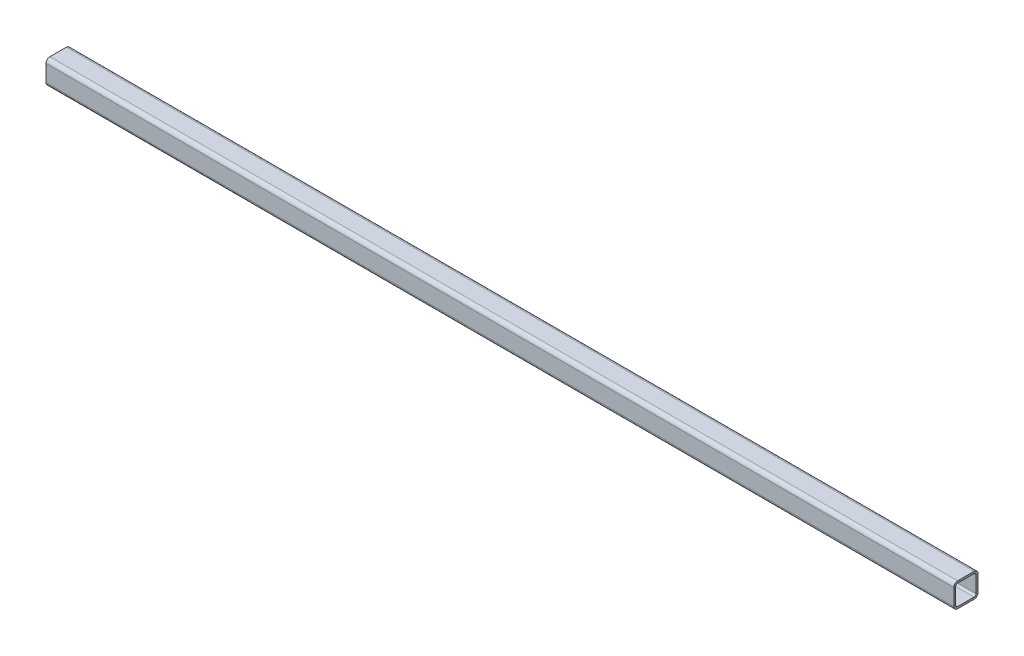
ISO-10303-21;
HEADER;
FILE_DESCRIPTION(('STEP AP214'),'2;1');
FILE_NAME('part.step','',(''),(''),'','','');
FILE_SCHEMA(('AUTOMOTIVE_DESIGN { 1 0 10303 214 1 1 1 1 }'));
ENDSEC;
DATA;
#1=APPLICATION_CONTEXT('core data for automotive mechanical design processes');
#2=APPLICATION_PROTOCOL_DEFINITION('international standard','automotive_design',2000,#1);
#3=PRODUCT_CONTEXT('',#1,'mechanical');
#4=PRODUCT('Part','Part','',(#3));
#5=PRODUCT_RELATED_PRODUCT_CATEGORY('part','',(#4));
#6=PRODUCT_DEFINITION_FORMATION('','',#4);
#7=PRODUCT_DEFINITION_CONTEXT('part definition',#1,'design');
#8=PRODUCT_DEFINITION('design','',#6,#7);
#9=PRODUCT_DEFINITION_SHAPE('','',#8);
#10=(LENGTH_UNIT() NAMED_UNIT(*) SI_UNIT(.MILLI.,.METRE.));
#11=(NAMED_UNIT(*) PLANE_ANGLE_UNIT() SI_UNIT($,.RADIAN.));
#12=(NAMED_UNIT(*) SI_UNIT($,.STERADIAN.) SOLID_ANGLE_UNIT());
#13=UNCERTAINTY_MEASURE_WITH_UNIT(LENGTH_MEASURE(1.E-05),#10,'distance_accuracy_value','');
#14=(GEOMETRIC_REPRESENTATION_CONTEXT(3) GLOBAL_UNCERTAINTY_ASSIGNED_CONTEXT((#13)) GLOBAL_UNIT_ASSIGNED_CONTEXT((#10,
#11,#12)) REPRESENTATION_CONTEXT('',''));
#15=CARTESIAN_POINT('',(0.,0.,0.));
#16=DIRECTION('',(0.,0.,1.));
#17=DIRECTION('',(1.,0.,0.));
#18=AXIS2_PLACEMENT_3D('',#15,#16,#17);
#19=CARTESIAN_POINT('',(1500.,13.6,-13.6));
#20=DIRECTION('',(-1.,0.,0.));
#21=DIRECTION('',(0.,0.,1.));
#22=AXIS2_PLACEMENT_3D('',#19,#20,#21);
#23=CYLINDRICAL_SURFACE('',#22,6.4);
#24=CARTESIAN_POINT('',(0.,13.6,-13.6));
#25=DIRECTION('',(1.,0.,0.));
#26=DIRECTION('',(0.,0.,-1.));
#27=AXIS2_PLACEMENT_3D('',#24,#25,#26);
#28=CIRCLE('',#27,6.4);
#29=CARTESIAN_POINT('',(0.,13.6,-20.));
#30=VERTEX_POINT('',#29);
#31=CARTESIAN_POINT('',(0.,20.,-13.6));
#32=VERTEX_POINT('',#31);
#33=EDGE_CURVE('E234',#30,#32,#28,.T.);
#34=ORIENTED_EDGE('',*,*,#33,.T.);
#35=DIRECTION('',(-1.,0.,0.));
#36=VECTOR('',#35,1.);
#37=CARTESIAN_POINT('',(1500.,20.,-13.6));
#38=LINE('',#37,#36);
#39=CARTESIAN_POINT('',(1500.,20.,-13.6));
#40=VERTEX_POINT('',#39);
#41=EDGE_CURVE('E12',#40,#32,#38,.T.);
#42=ORIENTED_EDGE('',*,*,#41,.F.);
#43=CARTESIAN_POINT('',(1500.,13.6,-13.6));
#44=DIRECTION('',(1.,0.,0.));
#45=DIRECTION('',(0.,0.,-1.));
#46=AXIS2_PLACEMENT_3D('',#43,#44,#45);
#47=CIRCLE('',#46,6.4);
#48=CARTESIAN_POINT('',(1500.,13.6,-20.));
#49=VERTEX_POINT('',#48);
#50=EDGE_CURVE('E312',#49,#40,#47,.T.);
#51=ORIENTED_EDGE('',*,*,#50,.F.);
#52=DIRECTION('',(-1.,0.,0.));
#53=VECTOR('',#52,1.);
#54=CARTESIAN_POINT('',(1500.,13.6,-20.));
#55=LINE('',#54,#53);
#56=EDGE_CURVE('E249',#49,#30,#55,.T.);
#57=ORIENTED_EDGE('',*,*,#56,.T.);
#58=EDGE_LOOP('',(#34,#42,#51,#57));
#59=FACE_BOUND('',#58,.T.);
#60=ADVANCED_FACE('F62',(#59),#23,.T.);
#61=CARTESIAN_POINT('',(1500.,20.,-13.6));
#62=DIRECTION('',(0.,-1.,0.));
#63=DIRECTION('',(0.,0.,-1.));
#64=AXIS2_PLACEMENT_3D('',#61,#62,#63);
#65=PLANE('',#64);
#66=DIRECTION('',(0.,0.,1.));
#67=VECTOR('',#66,1.);
#68=CARTESIAN_POINT('',(0.,20.,-13.6));
#69=LINE('',#68,#67);
#70=CARTESIAN_POINT('',(0.,20.,13.6));
#71=VERTEX_POINT('',#70);
#72=EDGE_CURVE('E237',#32,#71,#69,.T.);
#73=ORIENTED_EDGE('',*,*,#72,.T.);
#74=DIRECTION('',(-1.,0.,0.));
#75=VECTOR('',#74,1.);
#76=CARTESIAN_POINT('',(1500.,20.,13.6));
#77=LINE('',#76,#75);
#78=CARTESIAN_POINT('',(1500.,20.,13.6));
#79=VERTEX_POINT('',#78);
#80=EDGE_CURVE('E72',#79,#71,#77,.T.);
#81=ORIENTED_EDGE('',*,*,#80,.F.);
#82=DIRECTION('',(0.,0.,1.));
#83=VECTOR('',#82,1.);
#84=CARTESIAN_POINT('',(1500.,20.,-13.6));
#85=LINE('',#84,#83);
#86=EDGE_CURVE('E314',#40,#79,#85,.T.);
#87=ORIENTED_EDGE('',*,*,#86,.F.);
#88=ORIENTED_EDGE('',*,*,#41,.T.);
#89=EDGE_LOOP('',(#73,#81,#87,#88));
#90=FACE_BOUND('',#89,.T.);
#91=ADVANCED_FACE('F349',(#90),#65,.F.);
#92=CARTESIAN_POINT('',(1500.,13.6,13.6));
#93=DIRECTION('',(-1.,0.,0.));
#94=DIRECTION('',(0.,0.,1.));
#95=AXIS2_PLACEMENT_3D('',#92,#93,#94);
#96=CYLINDRICAL_SURFACE('',#95,6.4);
#97=CARTESIAN_POINT('',(0.,13.6,13.6));
#98=DIRECTION('',(1.,0.,0.));
#99=DIRECTION('',(0.,0.,-1.));
#100=AXIS2_PLACEMENT_3D('',#97,#98,#99);
#101=CIRCLE('',#100,6.4);
#102=CARTESIAN_POINT('',(0.,13.6,20.));
#103=VERTEX_POINT('',#102);
#104=EDGE_CURVE('E239',#71,#103,#101,.T.);
#105=ORIENTED_EDGE('',*,*,#104,.T.);
#106=DIRECTION('',(-1.,0.,0.));
#107=VECTOR('',#106,1.);
#108=CARTESIAN_POINT('',(1500.,13.6,20.));
#109=LINE('',#108,#107);
#110=CARTESIAN_POINT('',(1500.,13.6,20.));
#111=VERTEX_POINT('',#110);
#112=EDGE_CURVE('E256',#111,#103,#109,.T.);
#113=ORIENTED_EDGE('',*,*,#112,.F.);
#114=CARTESIAN_POINT('',(1500.,13.6,13.6));
#115=DIRECTION('',(1.,0.,0.));
#116=DIRECTION('',(0.,0.,-1.));
#117=AXIS2_PLACEMENT_3D('',#114,#115,#116);
#118=CIRCLE('',#117,6.4);
#119=EDGE_CURVE('E316',#79,#111,#118,.T.);
#120=ORIENTED_EDGE('',*,*,#119,.F.);
#121=ORIENTED_EDGE('',*,*,#80,.T.);
#122=EDGE_LOOP('',(#105,#113,#120,#121));
#123=FACE_BOUND('',#122,.T.);
#124=ADVANCED_FACE('F354',(#123),#96,.T.);
#125=CARTESIAN_POINT('',(1500.,-13.6,20.));
#126=DIRECTION('',(0.,0.,-1.));
#127=DIRECTION('',(0.,1.,0.));
#128=AXIS2_PLACEMENT_3D('',#125,#126,#127);
#129=PLANE('',#128);
#130=DIRECTION('',(0.,-1.,0.));
#131=VECTOR('',#130,1.);
#132=CARTESIAN_POINT('',(0.,-13.6,20.));
#133=LINE('',#132,#131);
#134=CARTESIAN_POINT('',(0.,-13.6,20.));
#135=VERTEX_POINT('',#134);
#136=EDGE_CURVE('E241',#103,#135,#133,.T.);
#137=ORIENTED_EDGE('',*,*,#136,.T.);
#138=DIRECTION('',(-1.,0.,0.));
#139=VECTOR('',#138,1.);
#140=CARTESIAN_POINT('',(1500.,-13.6,20.));
#141=LINE('',#140,#139);
#142=CARTESIAN_POINT('',(1500.,-13.6,20.));
#143=VERTEX_POINT('',#142);
#144=EDGE_CURVE('E253',#143,#135,#141,.T.);
#145=ORIENTED_EDGE('',*,*,#144,.F.);
#146=DIRECTION('',(0.,-1.,0.));
#147=VECTOR('',#146,1.);
#148=CARTESIAN_POINT('',(1500.,-13.6,20.));
#149=LINE('',#148,#147);
#150=EDGE_CURVE('E318',#111,#143,#149,.T.);
#151=ORIENTED_EDGE('',*,*,#150,.F.);
#152=ORIENTED_EDGE('',*,*,#112,.T.);
#153=EDGE_LOOP('',(#137,#145,#151,#152));
#154=FACE_BOUND('',#153,.T.);
#155=ADVANCED_FACE('F324',(#154),#129,.F.);
#156=CARTESIAN_POINT('',(1500.,-13.6,13.6));
#157=DIRECTION('',(-1.,0.,0.));
#158=DIRECTION('',(0.,0.,1.));
#159=AXIS2_PLACEMENT_3D('',#156,#157,#158);
#160=CYLINDRICAL_SURFACE('',#159,6.4);
#161=CARTESIAN_POINT('',(0.,-13.6,13.6));
#162=DIRECTION('',(1.,0.,0.));
#163=DIRECTION('',(0.,0.,-1.));
#164=AXIS2_PLACEMENT_3D('',#161,#162,#163);
#165=CIRCLE('',#164,6.4);
#166=CARTESIAN_POINT('',(0.,-20.,13.6));
#167=VERTEX_POINT('',#166);
#168=EDGE_CURVE('E243',#135,#167,#165,.T.);
#169=ORIENTED_EDGE('',*,*,#168,.T.);
#170=DIRECTION('',(-1.,0.,0.));
#171=VECTOR('',#170,1.);
#172=CARTESIAN_POINT('',(1500.,-20.,13.6));
#173=LINE('',#172,#171);
#174=CARTESIAN_POINT('',(1500.,-20.,13.6));
#175=VERTEX_POINT('',#174);
#176=EDGE_CURVE('E201',#175,#167,#173,.T.);
#177=ORIENTED_EDGE('',*,*,#176,.F.);
#178=CARTESIAN_POINT('',(1500.,-13.6,13.6));
#179=DIRECTION('',(1.,0.,0.));
#180=DIRECTION('',(0.,0.,-1.));
#181=AXIS2_PLACEMENT_3D('',#178,#179,#180);
#182=CIRCLE('',#181,6.4);
#183=EDGE_CURVE('E192',#143,#175,#182,.T.);
#184=ORIENTED_EDGE('',*,*,#183,.F.);
#185=ORIENTED_EDGE('',*,*,#144,.T.);
#186=EDGE_LOOP('',(#169,#177,#184,#185));
#187=FACE_BOUND('',#186,.T.);
#188=ADVANCED_FACE('F328',(#187),#160,.T.);
#189=CARTESIAN_POINT('',(1500.,-20.,13.6));
#190=DIRECTION('',(0.,1.,0.));
#191=DIRECTION('',(0.,0.,1.));
#192=AXIS2_PLACEMENT_3D('',#189,#190,#191);
#193=PLANE('',#192);
#194=DIRECTION('',(0.,0.,-1.));
#195=VECTOR('',#194,1.);
#196=CARTESIAN_POINT('',(0.,-20.,13.6));
#197=LINE('',#196,#195);
#198=CARTESIAN_POINT('',(0.,-20.,-13.6));
#199=VERTEX_POINT('',#198);
#200=EDGE_CURVE('E200',#167,#199,#197,.T.);
#201=ORIENTED_EDGE('',*,*,#200,.T.);
#202=DIRECTION('',(-1.,0.,0.));
#203=VECTOR('',#202,1.);
#204=CARTESIAN_POINT('',(1500.,-20.,-13.6));
#205=LINE('',#204,#203);
#206=CARTESIAN_POINT('',(1500.,-20.,-13.6));
#207=VERTEX_POINT('',#206);
#208=EDGE_CURVE('E197',#207,#199,#205,.T.);
#209=ORIENTED_EDGE('',*,*,#208,.F.);
#210=DIRECTION('',(0.,0.,-1.));
#211=VECTOR('',#210,1.);
#212=CARTESIAN_POINT('',(1500.,-20.,13.6));
#213=LINE('',#212,#211);
#214=EDGE_CURVE('E186',#175,#207,#213,.T.);
#215=ORIENTED_EDGE('',*,*,#214,.F.);
#216=ORIENTED_EDGE('',*,*,#176,.T.);
#217=EDGE_LOOP('',(#201,#209,#215,#216));
#218=FACE_BOUND('',#217,.T.);
#219=ADVANCED_FACE('F198',(#218),#193,.F.);
#220=CARTESIAN_POINT('',(1500.,-13.6,-13.6));
#221=DIRECTION('',(-1.,0.,0.));
#222=DIRECTION('',(0.,0.,1.));
#223=AXIS2_PLACEMENT_3D('',#220,#221,#222);
#224=CYLINDRICAL_SURFACE('',#223,6.4);
#225=CARTESIAN_POINT('',(0.,-13.6,-13.6));
#226=DIRECTION('',(1.,0.,0.));
#227=DIRECTION('',(0.,0.,-1.));
#228=AXIS2_PLACEMENT_3D('',#225,#226,#227);
#229=CIRCLE('',#228,6.4);
#230=CARTESIAN_POINT('',(0.,-13.6,-20.));
#231=VERTEX_POINT('',#230);
#232=EDGE_CURVE('E134',#199,#231,#229,.T.);
#233=ORIENTED_EDGE('',*,*,#232,.T.);
#234=DIRECTION('',(-1.,0.,0.));
#235=VECTOR('',#234,1.);
#236=CARTESIAN_POINT('',(1500.,-13.6,-20.));
#237=LINE('',#236,#235);
#238=CARTESIAN_POINT('',(1500.,-13.6,-20.));
#239=VERTEX_POINT('',#238);
#240=EDGE_CURVE('E202',#239,#231,#237,.T.);
#241=ORIENTED_EDGE('',*,*,#240,.F.);
#242=CARTESIAN_POINT('',(1500.,-13.6,-13.6));
#243=DIRECTION('',(1.,0.,0.));
#244=DIRECTION('',(0.,0.,-1.));
#245=AXIS2_PLACEMENT_3D('',#242,#243,#244);
#246=CIRCLE('',#245,6.4);
#247=EDGE_CURVE('E190',#207,#239,#246,.T.);
#248=ORIENTED_EDGE('',*,*,#247,.F.);
#249=ORIENTED_EDGE('',*,*,#208,.T.);
#250=EDGE_LOOP('',(#233,#241,#248,#249));
#251=FACE_BOUND('',#250,.T.);
#252=ADVANCED_FACE('F204',(#251),#224,.T.);
#253=CARTESIAN_POINT('',(1500.,13.6,13.6));
#254=DIRECTION('',(-1.,0.,0.));
#255=DIRECTION('',(0.,0.,1.));
#256=AXIS2_PLACEMENT_3D('',#253,#254,#255);
#257=CYLINDRICAL_SURFACE('',#256,3.2);
#258=CARTESIAN_POINT('',(0.,13.6,13.6));
#259=DIRECTION('',(1.,0.,0.));
#260=DIRECTION('',(0.,0.,-1.));
#261=AXIS2_PLACEMENT_3D('',#258,#259,#260);
#262=CIRCLE('',#261,3.2);
#263=CARTESIAN_POINT('',(0.,16.8,13.6));
#264=VERTEX_POINT('',#263);
#265=CARTESIAN_POINT('',(0.,13.6,16.8));
#266=VERTEX_POINT('',#265);
#267=EDGE_CURVE('E210',#264,#266,#262,.T.);
#268=ORIENTED_EDGE('',*,*,#267,.F.);
#269=DIRECTION('',(-1.,0.,0.));
#270=VECTOR('',#269,1.);
#271=CARTESIAN_POINT('',(1500.,16.8,13.6));
#272=LINE('',#271,#270);
#273=CARTESIAN_POINT('',(1500.,16.8,13.6));
#274=VERTEX_POINT('',#273);
#275=EDGE_CURVE('E66',#274,#264,#272,.T.);
#276=ORIENTED_EDGE('',*,*,#275,.F.);
#277=CARTESIAN_POINT('',(1500.,13.6,13.6));
#278=DIRECTION('',(1.,0.,0.));
#279=DIRECTION('',(0.,0.,-1.));
#280=AXIS2_PLACEMENT_3D('',#277,#278,#279);
#281=CIRCLE('',#280,3.2);
#282=CARTESIAN_POINT('',(1500.,13.6,16.8));
#283=VERTEX_POINT('',#282);
#284=EDGE_CURVE('E248',#274,#283,#281,.T.);
#285=ORIENTED_EDGE('',*,*,#284,.T.);
#286=DIRECTION('',(-1.,0.,0.));
#287=VECTOR('',#286,1.);
#288=CARTESIAN_POINT('',(1500.,13.6,16.8));
#289=LINE('',#288,#287);
#290=EDGE_CURVE('E206',#283,#266,#289,.T.);
#291=ORIENTED_EDGE('',*,*,#290,.T.);
#292=EDGE_LOOP('',(#268,#276,#285,#291));
#293=FACE_BOUND('',#292,.T.);
#294=ADVANCED_FACE('F64',(#293),#257,.F.);
#295=CARTESIAN_POINT('',(1500.,16.8,-13.6));
#296=DIRECTION('',(0.,-1.,0.));
#297=DIRECTION('',(0.,0.,-1.));
#298=AXIS2_PLACEMENT_3D('',#295,#296,#297);
#299=PLANE('',#298);
#300=DIRECTION('',(0.,0.,1.));
#301=VECTOR('',#300,1.);
#302=CARTESIAN_POINT('',(0.,16.8,-13.6));
#303=LINE('',#302,#301);
#304=CARTESIAN_POINT('',(0.,16.8,-13.6));
#305=VERTEX_POINT('',#304);
#306=EDGE_CURVE('E213',#305,#264,#303,.T.);
#307=ORIENTED_EDGE('',*,*,#306,.F.);
#308=DIRECTION('',(-1.,0.,0.));
#309=VECTOR('',#308,1.);
#310=CARTESIAN_POINT('',(1500.,16.8,-13.6));
#311=LINE('',#310,#309);
#312=CARTESIAN_POINT('',(1500.,16.8,-13.6));
#313=VERTEX_POINT('',#312);
#314=EDGE_CURVE('E271',#313,#305,#311,.T.);
#315=ORIENTED_EDGE('',*,*,#314,.F.);
#316=DIRECTION('',(0.,0.,1.));
#317=VECTOR('',#316,1.);
#318=CARTESIAN_POINT('',(1500.,16.8,-13.6));
#319=LINE('',#318,#317);
#320=EDGE_CURVE('E280',#313,#274,#319,.T.);
#321=ORIENTED_EDGE('',*,*,#320,.T.);
#322=ORIENTED_EDGE('',*,*,#275,.T.);
#323=EDGE_LOOP('',(#307,#315,#321,#322));
#324=FACE_BOUND('',#323,.T.);
#325=ADVANCED_FACE('F278',(#324),#299,.T.);
#326=CARTESIAN_POINT('',(1500.,13.6,-13.6));
#327=DIRECTION('',(-1.,0.,0.));
#328=DIRECTION('',(0.,0.,1.));
#329=AXIS2_PLACEMENT_3D('',#326,#327,#328);
#330=CYLINDRICAL_SURFACE('',#329,3.2);
#331=CARTESIAN_POINT('',(0.,13.6,-13.6));
#332=DIRECTION('',(1.,0.,0.));
#333=DIRECTION('',(0.,0.,-1.));
#334=AXIS2_PLACEMENT_3D('',#331,#332,#333);
#335=CIRCLE('',#334,3.2);
#336=CARTESIAN_POINT('',(0.,13.6,-16.8));
#337=VERTEX_POINT('',#336);
#338=EDGE_CURVE('E216',#337,#305,#335,.T.);
#339=ORIENTED_EDGE('',*,*,#338,.F.);
#340=DIRECTION('',(-1.,0.,0.));
#341=VECTOR('',#340,1.);
#342=CARTESIAN_POINT('',(1500.,13.6,-16.8));
#343=LINE('',#342,#341);
#344=CARTESIAN_POINT('',(1500.,13.6,-16.8));
#345=VERTEX_POINT('',#344);
#346=EDGE_CURVE('E270',#345,#337,#343,.T.);
#347=ORIENTED_EDGE('',*,*,#346,.F.);
#348=CARTESIAN_POINT('',(1500.,13.6,-13.6));
#349=DIRECTION('',(1.,0.,0.));
#350=DIRECTION('',(0.,0.,-1.));
#351=AXIS2_PLACEMENT_3D('',#348,#349,#350);
#352=CIRCLE('',#351,3.2);
#353=EDGE_CURVE('E288',#345,#313,#352,.T.);
#354=ORIENTED_EDGE('',*,*,#353,.T.);
#355=ORIENTED_EDGE('',*,*,#314,.T.);
#356=EDGE_LOOP('',(#339,#347,#354,#355));
#357=FACE_BOUND('',#356,.T.);
#358=ADVANCED_FACE('F286',(#357),#330,.F.);
#359=CARTESIAN_POINT('',(1500.,13.6,-16.8));
#360=DIRECTION('',(0.,0.,1.));
#361=DIRECTION('',(1.,0.,0.));
#362=AXIS2_PLACEMENT_3D('',#359,#360,#361);
#363=PLANE('',#362);
#364=DIRECTION('',(0.,1.,0.));
#365=VECTOR('',#364,1.);
#366=CARTESIAN_POINT('',(0.,13.6,-16.8));
#367=LINE('',#366,#365);
#368=CARTESIAN_POINT('',(0.,-13.6,-16.8));
#369=VERTEX_POINT('',#368);
#370=EDGE_CURVE('E219',#369,#337,#367,.T.);
#371=ORIENTED_EDGE('',*,*,#370,.F.);
#372=DIRECTION('',(-1.,0.,0.));
#373=VECTOR('',#372,1.);
#374=CARTESIAN_POINT('',(1500.,-13.6,-16.8));
#375=LINE('',#374,#373);
#376=CARTESIAN_POINT('',(1500.,-13.6,-16.8));
#377=VERTEX_POINT('',#376);
#378=EDGE_CURVE('E268',#377,#369,#375,.T.);
#379=ORIENTED_EDGE('',*,*,#378,.F.);
#380=DIRECTION('',(0.,1.,0.));
#381=VECTOR('',#380,1.);
#382=CARTESIAN_POINT('',(1500.,13.6,-16.8));
#383=LINE('',#382,#381);
#384=EDGE_CURVE('E294',#377,#345,#383,.T.);
#385=ORIENTED_EDGE('',*,*,#384,.T.);
#386=ORIENTED_EDGE('',*,*,#346,.T.);
#387=EDGE_LOOP('',(#371,#379,#385,#386));
#388=FACE_BOUND('',#387,.T.);
#389=ADVANCED_FACE('F297',(#388),#363,.T.);
#390=CARTESIAN_POINT('',(1500.,-13.6,-13.6));
#391=DIRECTION('',(-1.,0.,0.));
#392=DIRECTION('',(0.,0.,1.));
#393=AXIS2_PLACEMENT_3D('',#390,#391,#392);
#394=CYLINDRICAL_SURFACE('',#393,3.2);
#395=CARTESIAN_POINT('',(0.,-13.6,-13.6));
#396=DIRECTION('',(1.,0.,0.));
#397=DIRECTION('',(0.,0.,-1.));
#398=AXIS2_PLACEMENT_3D('',#395,#396,#397);
#399=CIRCLE('',#398,3.2);
#400=CARTESIAN_POINT('',(0.,-16.8,-13.6));
#401=VERTEX_POINT('',#400);
#402=EDGE_CURVE('E222',#401,#369,#399,.T.);
#403=ORIENTED_EDGE('',*,*,#402,.F.);
#404=DIRECTION('',(-1.,0.,0.));
#405=VECTOR('',#404,1.);
#406=CARTESIAN_POINT('',(1500.,-16.8,-13.6));
#407=LINE('',#406,#405);
#408=CARTESIAN_POINT('',(1500.,-16.8,-13.6));
#409=VERTEX_POINT('',#408);
#410=EDGE_CURVE('E266',#409,#401,#407,.T.);
#411=ORIENTED_EDGE('',*,*,#410,.F.);
#412=CARTESIAN_POINT('',(1500.,-13.6,-13.6));
#413=DIRECTION('',(1.,0.,0.));
#414=DIRECTION('',(0.,0.,-1.));
#415=AXIS2_PLACEMENT_3D('',#412,#413,#414);
#416=CIRCLE('',#415,3.2);
#417=EDGE_CURVE('E298',#409,#377,#416,.T.);
#418=ORIENTED_EDGE('',*,*,#417,.T.);
#419=ORIENTED_EDGE('',*,*,#378,.T.);
#420=EDGE_LOOP('',(#403,#411,#418,#419));
#421=FACE_BOUND('',#420,.T.);
#422=ADVANCED_FACE('F365',(#421),#394,.F.);
#423=CARTESIAN_POINT('',(1500.,-16.8,13.6));
#424=DIRECTION('',(0.,1.,0.));
#425=DIRECTION('',(0.,0.,1.));
#426=AXIS2_PLACEMENT_3D('',#423,#424,#425);
#427=PLANE('',#426);
#428=DIRECTION('',(0.,0.,-1.));
#429=VECTOR('',#428,1.);
#430=CARTESIAN_POINT('',(0.,-16.8,13.6));
#431=LINE('',#430,#429);
#432=CARTESIAN_POINT('',(0.,-16.8,13.6));
#433=VERTEX_POINT('',#432);
#434=EDGE_CURVE('E225',#433,#401,#431,.T.);
#435=ORIENTED_EDGE('',*,*,#434,.F.);
#436=DIRECTION('',(-1.,0.,0.));
#437=VECTOR('',#436,1.);
#438=CARTESIAN_POINT('',(1500.,-16.8,13.6));
#439=LINE('',#438,#437);
#440=CARTESIAN_POINT('',(1500.,-16.8,13.6));
#441=VERTEX_POINT('',#440);
#442=EDGE_CURVE('E264',#441,#433,#439,.T.);
#443=ORIENTED_EDGE('',*,*,#442,.F.);
#444=DIRECTION('',(0.,0.,-1.));
#445=VECTOR('',#444,1.);
#446=CARTESIAN_POINT('',(1500.,-16.8,13.6));
#447=LINE('',#446,#445);
#448=EDGE_CURVE('E300',#441,#409,#447,.T.);
#449=ORIENTED_EDGE('',*,*,#448,.T.);
#450=ORIENTED_EDGE('',*,*,#410,.T.);
#451=EDGE_LOOP('',(#435,#443,#449,#450));
#452=FACE_BOUND('',#451,.T.);
#453=ADVANCED_FACE('F361',(#452),#427,.T.);
#454=CARTESIAN_POINT('',(1500.,-13.6,13.6));
#455=DIRECTION('',(-1.,0.,0.));
#456=DIRECTION('',(0.,0.,1.));
#457=AXIS2_PLACEMENT_3D('',#454,#455,#456);
#458=CYLINDRICAL_SURFACE('',#457,3.2);
#459=CARTESIAN_POINT('',(0.,-13.6,13.6));
#460=DIRECTION('',(1.,0.,0.));
#461=DIRECTION('',(0.,0.,-1.));
#462=AXIS2_PLACEMENT_3D('',#459,#460,#461);
#463=CIRCLE('',#462,3.2);
#464=CARTESIAN_POINT('',(0.,-13.6,16.8));
#465=VERTEX_POINT('',#464);
#466=EDGE_CURVE('E228',#465,#433,#463,.T.);
#467=ORIENTED_EDGE('',*,*,#466,.F.);
#468=DIRECTION('',(-1.,0.,0.));
#469=VECTOR('',#468,1.);
#470=CARTESIAN_POINT('',(1500.,-13.6,16.8));
#471=LINE('',#470,#469);
#472=CARTESIAN_POINT('',(1500.,-13.6,16.8));
#473=VERTEX_POINT('',#472);
#474=EDGE_CURVE('E262',#473,#465,#471,.T.);
#475=ORIENTED_EDGE('',*,*,#474,.F.);
#476=CARTESIAN_POINT('',(1500.,-13.6,13.6));
#477=DIRECTION('',(1.,0.,0.));
#478=DIRECTION('',(0.,0.,-1.));
#479=AXIS2_PLACEMENT_3D('',#476,#477,#478);
#480=CIRCLE('',#479,3.2);
#481=EDGE_CURVE('E306',#473,#441,#480,.T.);
#482=ORIENTED_EDGE('',*,*,#481,.T.);
#483=ORIENTED_EDGE('',*,*,#442,.T.);
#484=EDGE_LOOP('',(#467,#475,#482,#483));
#485=FACE_BOUND('',#484,.T.);
#486=ADVANCED_FACE('F343',(#485),#458,.F.);
#487=CARTESIAN_POINT('',(1500.,-13.6,16.8));
#488=DIRECTION('',(0.,0.,-1.));
#489=DIRECTION('',(0.,1.,0.));
#490=AXIS2_PLACEMENT_3D('',#487,#488,#489);
#491=PLANE('',#490);
#492=DIRECTION('',(0.,-1.,0.));
#493=VECTOR('',#492,1.);
#494=CARTESIAN_POINT('',(0.,-13.6,16.8));
#495=LINE('',#494,#493);
#496=EDGE_CURVE('E231',#266,#465,#495,.T.);
#497=ORIENTED_EDGE('',*,*,#496,.F.);
#498=ORIENTED_EDGE('',*,*,#290,.F.);
#499=DIRECTION('',(0.,-1.,0.));
#500=VECTOR('',#499,1.);
#501=CARTESIAN_POINT('',(1500.,-13.6,16.8));
#502=LINE('',#501,#500);
#503=EDGE_CURVE('E309',#283,#473,#502,.T.);
#504=ORIENTED_EDGE('',*,*,#503,.T.);
#505=ORIENTED_EDGE('',*,*,#474,.T.);
#506=EDGE_LOOP('',(#497,#498,#504,#505));
#507=FACE_BOUND('',#506,.T.);
#508=ADVANCED_FACE('F336',(#507),#491,.T.);
#509=CARTESIAN_POINT('',(1500.,13.6,-20.));
#510=DIRECTION('',(0.,0.,1.));
#511=DIRECTION('',(1.,0.,0.));
#512=AXIS2_PLACEMENT_3D('',#509,#510,#511);
#513=PLANE('',#512);
#514=DIRECTION('',(0.,1.,0.));
#515=VECTOR('',#514,1.);
#516=CARTESIAN_POINT('',(0.,13.6,-20.));
#517=LINE('',#516,#515);
#518=EDGE_CURVE('E140',#231,#30,#517,.T.);
#519=ORIENTED_EDGE('',*,*,#518,.T.);
#520=ORIENTED_EDGE('',*,*,#56,.F.);
#521=DIRECTION('',(0.,1.,0.));
#522=VECTOR('',#521,1.);
#523=CARTESIAN_POINT('',(1500.,13.6,-20.));
#524=LINE('',#523,#522);
#525=EDGE_CURVE('E81',#239,#49,#524,.T.);
#526=ORIENTED_EDGE('',*,*,#525,.F.);
#527=ORIENTED_EDGE('',*,*,#240,.T.);
#528=EDGE_LOOP('',(#519,#520,#526,#527));
#529=FACE_BOUND('',#528,.T.);
#530=ADVANCED_FACE('F334',(#529),#513,.F.);
#531=CARTESIAN_POINT('',(1500.,13.6,-13.6));
#532=DIRECTION('',(1.,0.,0.));
#533=DIRECTION('',(0.,0.,-1.));
#534=AXIS2_PLACEMENT_3D('',#531,#532,#533);
#535=PLANE('',#534);
#536=ORIENTED_EDGE('',*,*,#284,.F.);
#537=ORIENTED_EDGE('',*,*,#320,.F.);
#538=ORIENTED_EDGE('',*,*,#353,.F.);
#539=ORIENTED_EDGE('',*,*,#384,.F.);
#540=ORIENTED_EDGE('',*,*,#417,.F.);
#541=ORIENTED_EDGE('',*,*,#448,.F.);
#542=ORIENTED_EDGE('',*,*,#481,.F.);
#543=ORIENTED_EDGE('',*,*,#503,.F.);
#544=EDGE_LOOP('',(#536,#537,#538,#539,#540,#541,#542,#543));
#545=FACE_BOUND('',#544,.T.);
#546=ORIENTED_EDGE('',*,*,#50,.T.);
#547=ORIENTED_EDGE('',*,*,#86,.T.);
#548=ORIENTED_EDGE('',*,*,#119,.T.);
#549=ORIENTED_EDGE('',*,*,#150,.T.);
#550=ORIENTED_EDGE('',*,*,#183,.T.);
#551=ORIENTED_EDGE('',*,*,#214,.T.);
#552=ORIENTED_EDGE('',*,*,#247,.T.);
#553=ORIENTED_EDGE('',*,*,#525,.T.);
#554=EDGE_LOOP('',(#546,#547,#548,#549,#550,#551,#552,#553));
#555=FACE_BOUND('',#554,.T.);
#556=ADVANCED_FACE('F188',(#545,#555),#535,.T.);
#557=CARTESIAN_POINT('',(0.,13.6,-13.6));
#558=DIRECTION('',(1.,0.,0.));
#559=DIRECTION('',(0.,0.,-1.));
#560=AXIS2_PLACEMENT_3D('',#557,#558,#559);
#561=PLANE('',#560);
#562=ORIENTED_EDGE('',*,*,#267,.T.);
#563=ORIENTED_EDGE('',*,*,#496,.T.);
#564=ORIENTED_EDGE('',*,*,#466,.T.);
#565=ORIENTED_EDGE('',*,*,#434,.T.);
#566=ORIENTED_EDGE('',*,*,#402,.T.);
#567=ORIENTED_EDGE('',*,*,#370,.T.);
#568=ORIENTED_EDGE('',*,*,#338,.T.);
#569=ORIENTED_EDGE('',*,*,#306,.T.);
#570=EDGE_LOOP('',(#562,#563,#564,#565,#566,#567,#568,#569));
#571=FACE_BOUND('',#570,.T.);
#572=ORIENTED_EDGE('',*,*,#33,.F.);
#573=ORIENTED_EDGE('',*,*,#518,.F.);
#574=ORIENTED_EDGE('',*,*,#232,.F.);
#575=ORIENTED_EDGE('',*,*,#200,.F.);
#576=ORIENTED_EDGE('',*,*,#168,.F.);
#577=ORIENTED_EDGE('',*,*,#136,.F.);
#578=ORIENTED_EDGE('',*,*,#104,.F.);
#579=ORIENTED_EDGE('',*,*,#72,.F.);
#580=EDGE_LOOP('',(#572,#573,#574,#575,#576,#577,#578,#579));
#581=FACE_BOUND('',#580,.T.);
#582=ADVANCED_FACE('F283',(#571,#581),#561,.F.);
#583=CLOSED_SHELL('',(#60,#91,#124,#155,#188,#219,#252,#294,#325,#358,#389,#422,#453,#486,#508,
#530,#556,#582));
#584=MANIFOLD_SOLID_BREP('B2',#583);
#585=ADVANCED_BREP_SHAPE_REPRESENTATION('',(#18,#584),#14);
#586=SHAPE_DEFINITION_REPRESENTATION(#9,#585);
ENDSEC;
END-ISO-10303-21;
